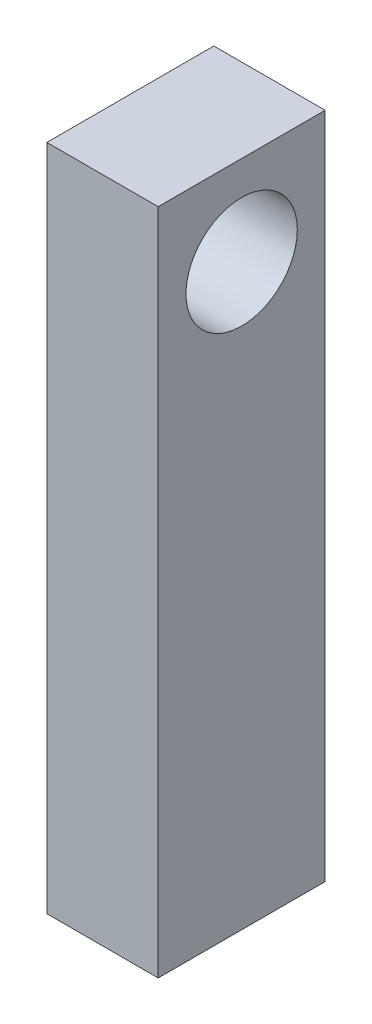
ISO-10303-21;
HEADER;
FILE_DESCRIPTION(('STEP AP214'),'2;1');
FILE_NAME('part.step','',(''),(''),'','','');
FILE_SCHEMA(('AUTOMOTIVE_DESIGN { 1 0 10303 214 1 1 1 1 }'));
ENDSEC;
DATA;
#1=APPLICATION_CONTEXT('core data for automotive mechanical design processes');
#2=APPLICATION_PROTOCOL_DEFINITION('international standard','automotive_design',2000,#1);
#3=PRODUCT_CONTEXT('',#1,'mechanical');
#4=PRODUCT('Part','Part','',(#3));
#5=PRODUCT_RELATED_PRODUCT_CATEGORY('part','',(#4));
#6=PRODUCT_DEFINITION_FORMATION('','',#4);
#7=PRODUCT_DEFINITION_CONTEXT('part definition',#1,'design');
#8=PRODUCT_DEFINITION('design','',#6,#7);
#9=PRODUCT_DEFINITION_SHAPE('','',#8);
#10=(LENGTH_UNIT() NAMED_UNIT(*) SI_UNIT(.MILLI.,.METRE.));
#11=(NAMED_UNIT(*) PLANE_ANGLE_UNIT() SI_UNIT($,.RADIAN.));
#12=(NAMED_UNIT(*) SI_UNIT($,.STERADIAN.) SOLID_ANGLE_UNIT());
#13=UNCERTAINTY_MEASURE_WITH_UNIT(LENGTH_MEASURE(1.E-05),#10,'distance_accuracy_value','');
#14=(GEOMETRIC_REPRESENTATION_CONTEXT(3) GLOBAL_UNCERTAINTY_ASSIGNED_CONTEXT((#13)) GLOBAL_UNIT_ASSIGNED_CONTEXT((#10,
#11,#12)) REPRESENTATION_CONTEXT('',''));
#15=CARTESIAN_POINT('',(0.,0.,0.));
#16=DIRECTION('',(0.,0.,1.));
#17=DIRECTION('',(1.,0.,0.));
#18=AXIS2_PLACEMENT_3D('',#15,#16,#17);
#19=CARTESIAN_POINT('',(20.,0.,0.));
#20=DIRECTION('',(1.,0.,0.));
#21=DIRECTION('',(0.,0.,-1.));
#22=AXIS2_PLACEMENT_3D('',#19,#20,#21);
#23=PLANE('',#22);
#24=DIRECTION('',(0.,1.,0.));
#25=VECTOR('',#24,1.);
#26=CARTESIAN_POINT('',(20.,60.,-15.));
#27=LINE('',#26,#25);
#28=CARTESIAN_POINT('',(20.,-60.,-15.));
#29=VERTEX_POINT('',#28);
#30=CARTESIAN_POINT('',(20.,60.,-15.));
#31=VERTEX_POINT('',#30);
#32=EDGE_CURVE('E85',#29,#31,#27,.T.);
#33=ORIENTED_EDGE('',*,*,#32,.T.);
#34=DIRECTION('',(0.,0.,1.));
#35=VECTOR('',#34,1.);
#36=CARTESIAN_POINT('',(20.,60.,15.));
#37=LINE('',#36,#35);
#38=CARTESIAN_POINT('',(20.,60.,15.));
#39=VERTEX_POINT('',#38);
#40=EDGE_CURVE('E80',#31,#39,#37,.T.);
#41=ORIENTED_EDGE('',*,*,#40,.T.);
#42=DIRECTION('',(0.,-1.,0.));
#43=VECTOR('',#42,1.);
#44=CARTESIAN_POINT('',(20.,60.,15.));
#45=LINE('',#44,#43);
#46=CARTESIAN_POINT('',(20.,-60.,15.));
#47=VERTEX_POINT('',#46);
#48=EDGE_CURVE('E83',#39,#47,#45,.T.);
#49=ORIENTED_EDGE('',*,*,#48,.T.);
#50=DIRECTION('',(0.,0.,-1.));
#51=VECTOR('',#50,1.);
#52=CARTESIAN_POINT('',(20.,-60.,15.));
#53=LINE('',#52,#51);
#54=EDGE_CURVE('E50',#47,#29,#53,.T.);
#55=ORIENTED_EDGE('',*,*,#54,.T.);
#56=EDGE_LOOP('',(#33,#41,#49,#55));
#57=FACE_BOUND('',#56,.T.);
#58=CARTESIAN_POINT('',(20.,43.930835869618,0.));
#59=DIRECTION('',(1.,0.,0.));
#60=DIRECTION('',(0.,0.,-1.));
#61=AXIS2_PLACEMENT_3D('',#58,#59,#60);
#62=CIRCLE('',#61,10.);
#63=CARTESIAN_POINT('',(20.,43.930835869618,-10.));
#64=VERTEX_POINT('',#63);
#65=EDGE_CURVE('E100',#64,#64,#62,.T.);
#66=ORIENTED_EDGE('',*,*,#65,.F.);
#67=EDGE_LOOP('',(#66));
#68=FACE_BOUND('',#67,.T.);
#69=ADVANCED_FACE('F33',(#57,#68),#23,.T.);
#70=CARTESIAN_POINT('',(0.,0.,0.));
#71=DIRECTION('',(1.,0.,0.));
#72=DIRECTION('',(0.,0.,-1.));
#73=AXIS2_PLACEMENT_3D('',#70,#71,#72);
#74=PLANE('',#73);
#75=DIRECTION('',(0.,1.,0.));
#76=VECTOR('',#75,1.);
#77=CARTESIAN_POINT('',(0.,60.,-15.));
#78=LINE('',#77,#76);
#79=CARTESIAN_POINT('',(0.,-60.,-15.));
#80=VERTEX_POINT('',#79);
#81=CARTESIAN_POINT('',(0.,60.,-15.));
#82=VERTEX_POINT('',#81);
#83=EDGE_CURVE('E97',#80,#82,#78,.T.);
#84=ORIENTED_EDGE('',*,*,#83,.F.);
#85=DIRECTION('',(0.,0.,-1.));
#86=VECTOR('',#85,1.);
#87=CARTESIAN_POINT('',(0.,-60.,15.));
#88=LINE('',#87,#86);
#89=CARTESIAN_POINT('',(0.,-60.,15.));
#90=VERTEX_POINT('',#89);
#91=EDGE_CURVE('E73',#90,#80,#88,.T.);
#92=ORIENTED_EDGE('',*,*,#91,.F.);
#93=DIRECTION('',(0.,-1.,0.));
#94=VECTOR('',#93,1.);
#95=CARTESIAN_POINT('',(0.,60.,15.));
#96=LINE('',#95,#94);
#97=CARTESIAN_POINT('',(0.,60.,15.));
#98=VERTEX_POINT('',#97);
#99=EDGE_CURVE('E67',#98,#90,#96,.T.);
#100=ORIENTED_EDGE('',*,*,#99,.F.);
#101=DIRECTION('',(0.,0.,1.));
#102=VECTOR('',#101,1.);
#103=CARTESIAN_POINT('',(0.,60.,15.));
#104=LINE('',#103,#102);
#105=EDGE_CURVE('E89',#82,#98,#104,.T.);
#106=ORIENTED_EDGE('',*,*,#105,.F.);
#107=EDGE_LOOP('',(#84,#92,#100,#106));
#108=FACE_BOUND('',#107,.T.);
#109=CARTESIAN_POINT('',(0.,43.930835869618,0.));
#110=DIRECTION('',(1.,0.,0.));
#111=DIRECTION('',(0.,0.,-1.));
#112=AXIS2_PLACEMENT_3D('',#109,#110,#111);
#113=CIRCLE('',#112,10.);
#114=CARTESIAN_POINT('',(0.,43.930835869618,-10.));
#115=VERTEX_POINT('',#114);
#116=EDGE_CURVE('E112',#115,#115,#113,.T.);
#117=ORIENTED_EDGE('',*,*,#116,.T.);
#118=EDGE_LOOP('',(#117));
#119=FACE_BOUND('',#118,.T.);
#120=ADVANCED_FACE('F108',(#108,#119),#74,.F.);
#121=CARTESIAN_POINT('',(20.,60.,-15.));
#122=DIRECTION('',(0.,0.,1.));
#123=DIRECTION('',(0.,-1.,0.));
#124=AXIS2_PLACEMENT_3D('',#121,#122,#123);
#125=PLANE('',#124);
#126=ORIENTED_EDGE('',*,*,#83,.T.);
#127=DIRECTION('',(-1.,0.,0.));
#128=VECTOR('',#127,1.);
#129=CARTESIAN_POINT('',(20.,60.,-15.));
#130=LINE('',#129,#128);
#131=EDGE_CURVE('E11',#31,#82,#130,.T.);
#132=ORIENTED_EDGE('',*,*,#131,.F.);
#133=ORIENTED_EDGE('',*,*,#32,.F.);
#134=DIRECTION('',(-1.,0.,0.));
#135=VECTOR('',#134,1.);
#136=CARTESIAN_POINT('',(20.,-60.,-15.));
#137=LINE('',#136,#135);
#138=EDGE_CURVE('E93',#29,#80,#137,.T.);
#139=ORIENTED_EDGE('',*,*,#138,.T.);
#140=EDGE_LOOP('',(#126,#132,#133,#139));
#141=FACE_BOUND('',#140,.T.);
#142=ADVANCED_FACE('F35',(#141),#125,.F.);
#143=CARTESIAN_POINT('',(20.,60.,15.));
#144=DIRECTION('',(0.,-1.,0.));
#145=DIRECTION('',(0.,0.,-1.));
#146=AXIS2_PLACEMENT_3D('',#143,#144,#145);
#147=PLANE('',#146);
#148=ORIENTED_EDGE('',*,*,#105,.T.);
#149=DIRECTION('',(-1.,0.,0.));
#150=VECTOR('',#149,1.);
#151=CARTESIAN_POINT('',(20.,60.,15.));
#152=LINE('',#151,#150);
#153=EDGE_CURVE('E42',#39,#98,#152,.T.);
#154=ORIENTED_EDGE('',*,*,#153,.F.);
#155=ORIENTED_EDGE('',*,*,#40,.F.);
#156=ORIENTED_EDGE('',*,*,#131,.T.);
#157=EDGE_LOOP('',(#148,#154,#155,#156));
#158=FACE_BOUND('',#157,.T.);
#159=ADVANCED_FACE('F88',(#158),#147,.F.);
#160=CARTESIAN_POINT('',(20.,60.,15.));
#161=DIRECTION('',(0.,0.,-1.));
#162=DIRECTION('',(0.,1.,0.));
#163=AXIS2_PLACEMENT_3D('',#160,#161,#162);
#164=PLANE('',#163);
#165=ORIENTED_EDGE('',*,*,#99,.T.);
#166=DIRECTION('',(-1.,0.,0.));
#167=VECTOR('',#166,1.);
#168=CARTESIAN_POINT('',(20.,-60.,15.));
#169=LINE('',#168,#167);
#170=EDGE_CURVE('E90',#47,#90,#169,.T.);
#171=ORIENTED_EDGE('',*,*,#170,.F.);
#172=ORIENTED_EDGE('',*,*,#48,.F.);
#173=ORIENTED_EDGE('',*,*,#153,.T.);
#174=EDGE_LOOP('',(#165,#171,#172,#173));
#175=FACE_BOUND('',#174,.T.);
#176=ADVANCED_FACE('F91',(#175),#164,.F.);
#177=CARTESIAN_POINT('',(20.,-60.,15.));
#178=DIRECTION('',(0.,1.,0.));
#179=DIRECTION('',(0.,0.,1.));
#180=AXIS2_PLACEMENT_3D('',#177,#178,#179);
#181=PLANE('',#180);
#182=ORIENTED_EDGE('',*,*,#91,.T.);
#183=ORIENTED_EDGE('',*,*,#138,.F.);
#184=ORIENTED_EDGE('',*,*,#54,.F.);
#185=ORIENTED_EDGE('',*,*,#170,.T.);
#186=EDGE_LOOP('',(#182,#183,#184,#185));
#187=FACE_BOUND('',#186,.T.);
#188=ADVANCED_FACE('F105',(#187),#181,.F.);
#189=CARTESIAN_POINT('',(20.,43.930835869618,0.));
#190=DIRECTION('',(-1.,0.,0.));
#191=DIRECTION('',(0.,0.,1.));
#192=AXIS2_PLACEMENT_3D('',#189,#190,#191);
#193=CYLINDRICAL_SURFACE('',#192,10.);
#194=ORIENTED_EDGE('',*,*,#65,.T.);
#195=EDGE_LOOP('',(#194));
#196=FACE_BOUND('',#195,.T.);
#197=ORIENTED_EDGE('',*,*,#116,.F.);
#198=EDGE_LOOP('',(#197));
#199=FACE_BOUND('',#198,.T.);
#200=ADVANCED_FACE('F118',(#196,#199),#193,.F.);
#201=CLOSED_SHELL('',(#69,#120,#142,#159,#176,#188,#200));
#202=MANIFOLD_SOLID_BREP('B2',#201);
#203=ADVANCED_BREP_SHAPE_REPRESENTATION('',(#18,#202),#14);
#204=SHAPE_DEFINITION_REPRESENTATION(#9,#203);
ENDSEC;
END-ISO-10303-21;
